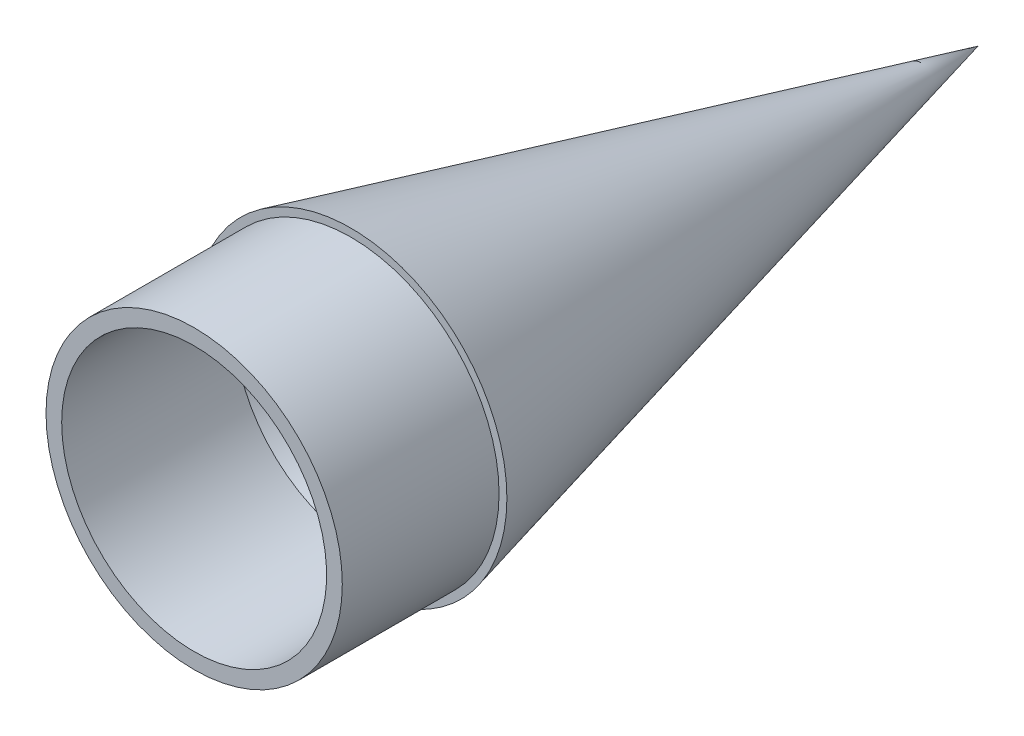
ISO-10303-21;
HEADER;
FILE_DESCRIPTION(('STEP AP214'),'2;1');
FILE_NAME('part.step','',(''),(''),'','','');
FILE_SCHEMA(('AUTOMOTIVE_DESIGN { 1 0 10303 214 1 1 1 1 }'));
ENDSEC;
DATA;
#1=APPLICATION_CONTEXT('core data for automotive mechanical design processes');
#2=APPLICATION_PROTOCOL_DEFINITION('international standard','automotive_design',2000,#1);
#3=PRODUCT_CONTEXT('',#1,'mechanical');
#4=PRODUCT('Part','Part','',(#3));
#5=PRODUCT_RELATED_PRODUCT_CATEGORY('part','',(#4));
#6=PRODUCT_DEFINITION_FORMATION('','',#4);
#7=PRODUCT_DEFINITION_CONTEXT('part definition',#1,'design');
#8=PRODUCT_DEFINITION('design','',#6,#7);
#9=PRODUCT_DEFINITION_SHAPE('','',#8);
#10=(LENGTH_UNIT() NAMED_UNIT(*) SI_UNIT(.MILLI.,.METRE.));
#11=(NAMED_UNIT(*) PLANE_ANGLE_UNIT() SI_UNIT($,.RADIAN.));
#12=(NAMED_UNIT(*) SI_UNIT($,.STERADIAN.) SOLID_ANGLE_UNIT());
#13=UNCERTAINTY_MEASURE_WITH_UNIT(LENGTH_MEASURE(1.E-05),#10,'distance_accuracy_value','');
#14=(GEOMETRIC_REPRESENTATION_CONTEXT(3) GLOBAL_UNCERTAINTY_ASSIGNED_CONTEXT((#13)) GLOBAL_UNIT_ASSIGNED_CONTEXT((#10,
#11,#12)) REPRESENTATION_CONTEXT('',''));
#15=CARTESIAN_POINT('',(0.,0.,0.));
#16=DIRECTION('',(0.,0.,1.));
#17=DIRECTION('',(1.,0.,0.));
#18=AXIS2_PLACEMENT_3D('',#15,#16,#17);
#19=CARTESIAN_POINT('',(-17.6436635561616,0.,20.));
#20=DIRECTION('',(0.,0.,-1.));
#21=DIRECTION('',(-1.,0.,0.));
#22=AXIS2_PLACEMENT_3D('',#19,#20,#21);
#23=PLANE('',#22);
#24=CARTESIAN_POINT('',(0.,0.,20.));
#25=DIRECTION('',(0.,0.,-1.));
#26=DIRECTION('',(-1.,0.,0.));
#27=AXIS2_PLACEMENT_3D('',#24,#25,#26);
#28=CIRCLE('',#27,16.9);
#29=CARTESIAN_POINT('',(-16.9,0.,20.));
#30=VERTEX_POINT('',#29);
#31=EDGE_CURVE('E74',#30,#30,#28,.F.);
#32=ORIENTED_EDGE('',*,*,#31,.F.);
#33=EDGE_LOOP('',(#32));
#34=FACE_BOUND('',#33,.T.);
#35=CARTESIAN_POINT('',(0.,0.,20.));
#36=DIRECTION('',(0.,0.,1.));
#37=DIRECTION('',(1.,0.,0.));
#38=AXIS2_PLACEMENT_3D('',#35,#36,#37);
#39=CIRCLE('',#38,18.9);
#40=CARTESIAN_POINT('',(18.9,0.,20.));
#41=VERTEX_POINT('',#40);
#42=EDGE_CURVE('E11',#41,#41,#39,.T.);
#43=ORIENTED_EDGE('',*,*,#42,.T.);
#44=EDGE_LOOP('',(#43));
#45=FACE_BOUND('',#44,.T.);
#46=ADVANCED_FACE('F37',(#34,#45),#23,.F.);
#47=CARTESIAN_POINT('',(0.,0.,20.));
#48=DIRECTION('',(0.,0.,1.));
#49=DIRECTION('',(1.,0.,0.));
#50=AXIS2_PLACEMENT_3D('',#47,#48,#49);
#51=CYLINDRICAL_SURFACE('',#50,18.9);
#52=ORIENTED_EDGE('',*,*,#42,.F.);
#53=EDGE_LOOP('',(#52));
#54=FACE_BOUND('',#53,.T.);
#55=CARTESIAN_POINT('',(0.,0.,0.));
#56=DIRECTION('',(0.,0.,1.));
#57=DIRECTION('',(1.,0.,0.));
#58=AXIS2_PLACEMENT_3D('',#55,#56,#57);
#59=CIRCLE('',#58,18.9);
#60=CARTESIAN_POINT('',(18.9,0.,0.));
#61=VERTEX_POINT('',#60);
#62=EDGE_CURVE('E44',#61,#61,#59,.T.);
#63=ORIENTED_EDGE('',*,*,#62,.T.);
#64=EDGE_LOOP('',(#63));
#65=FACE_BOUND('',#64,.T.);
#66=ADVANCED_FACE('F64',(#54,#65),#51,.T.);
#67=CARTESIAN_POINT('',(-19.9,0.,0.));
#68=DIRECTION('',(0.,0.,-1.));
#69=DIRECTION('',(-1.,0.,0.));
#70=AXIS2_PLACEMENT_3D('',#67,#68,#69);
#71=PLANE('',#70);
#72=ORIENTED_EDGE('',*,*,#62,.F.);
#73=EDGE_LOOP('',(#72));
#74=FACE_BOUND('',#73,.T.);
#75=CARTESIAN_POINT('',(0.,0.,0.));
#76=DIRECTION('',(0.,0.,1.));
#77=DIRECTION('',(1.,0.,0.));
#78=AXIS2_PLACEMENT_3D('',#75,#76,#77);
#79=CIRCLE('',#78,19.9);
#80=CARTESIAN_POINT('',(19.9,0.,0.));
#81=VERTEX_POINT('',#80);
#82=EDGE_CURVE('E80',#81,#81,#79,.T.);
#83=ORIENTED_EDGE('',*,*,#82,.T.);
#84=EDGE_LOOP('',(#83));
#85=FACE_BOUND('',#84,.T.);
#86=ADVANCED_FACE('F69',(#74,#85),#71,.F.);
#87=CARTESIAN_POINT('',(0.,0.,-80.));
#88=DIRECTION('',(0.,0.,1.));
#89=DIRECTION('',(1.,0.,0.));
#90=AXIS2_PLACEMENT_3D('',#87,#88,#89);
#91=CONICAL_SURFACE('',#90,0.,0.243801846959323);
#92=ORIENTED_EDGE('',*,*,#82,.F.);
#93=EDGE_LOOP('',(#92));
#94=FACE_BOUND('',#93,.T.);
#95=CARTESIAN_POINT('',(0.,0.,-80.));
#96=VERTEX_POINT('',#95);
#97=VERTEX_LOOP('',#96);
#98=FACE_BOUND('',#97,.T.);
#99=ADVANCED_FACE('F93',(#94,#98),#91,.T.);
#100=CARTESIAN_POINT('',(0.,0.,20.));
#101=DIRECTION('',(0.,0.,1.));
#102=DIRECTION('',(1.,0.,0.));
#103=AXIS2_PLACEMENT_3D('',#100,#101,#102);
#104=CYLINDRICAL_SURFACE('',#103,16.9);
#105=ORIENTED_EDGE('',*,*,#31,.T.);
#106=EDGE_LOOP('',(#105));
#107=FACE_BOUND('',#106,.T.);
#108=CARTESIAN_POINT('',(0.,0.,-2.));
#109=DIRECTION('',(0.,0.,-1.));
#110=DIRECTION('',(-1.,0.,0.));
#111=AXIS2_PLACEMENT_3D('',#108,#109,#110);
#112=CIRCLE('',#111,16.9);
#113=CARTESIAN_POINT('',(-16.9,0.,-2.));
#114=VERTEX_POINT('',#113);
#115=EDGE_CURVE('E85',#114,#114,#112,.F.);
#116=ORIENTED_EDGE('',*,*,#115,.F.);
#117=EDGE_LOOP('',(#116));
#118=FACE_BOUND('',#117,.T.);
#119=ADVANCED_FACE('F58',(#107,#118),#104,.F.);
#120=CARTESIAN_POINT('',(-19.9,0.,-2.));
#121=DIRECTION('',(0.,0.,-1.));
#122=DIRECTION('',(-1.,0.,0.));
#123=AXIS2_PLACEMENT_3D('',#120,#121,#122);
#124=PLANE('',#123);
#125=ORIENTED_EDGE('',*,*,#115,.T.);
#126=EDGE_LOOP('',(#125));
#127=FACE_BOUND('',#126,.T.);
#128=CARTESIAN_POINT('',(0.,0.,-2.));
#129=DIRECTION('',(0.,0.,-1.));
#130=DIRECTION('',(-1.,0.,0.));
#131=AXIS2_PLACEMENT_3D('',#128,#129,#130);
#132=CIRCLE('',#131,17.3415520991544);
#133=CARTESIAN_POINT('',(-17.3415520991544,0.,-2.));
#134=VERTEX_POINT('',#133);
#135=EDGE_CURVE('E86',#134,#134,#132,.F.);
#136=ORIENTED_EDGE('',*,*,#135,.F.);
#137=EDGE_LOOP('',(#136));
#138=FACE_BOUND('',#137,.T.);
#139=ADVANCED_FACE('F52',(#127,#138),#124,.T.);
#140=CARTESIAN_POINT('',(0.,0.,-71.7147823081583));
#141=DIRECTION('',(0.,0.,1.));
#142=DIRECTION('',(1.,0.,0.));
#143=AXIS2_PLACEMENT_3D('',#140,#141,#142);
#144=CONICAL_SURFACE('',#143,0.,0.243801846959323);
#145=ORIENTED_EDGE('',*,*,#135,.T.);
#146=EDGE_LOOP('',(#145));
#147=FACE_BOUND('',#146,.T.);
#148=CARTESIAN_POINT('',(0.,0.,-71.7147823081583));
#149=VERTEX_POINT('',#148);
#150=VERTEX_LOOP('',#149);
#151=FACE_BOUND('',#150,.T.);
#152=ADVANCED_FACE('F50',(#147,#151),#144,.F.);
#153=CLOSED_SHELL('',(#46,#66,#86,#99,#119,#139,#152));
#154=MANIFOLD_SOLID_BREP('B2',#153);
#155=ADVANCED_BREP_SHAPE_REPRESENTATION('',(#18,#154),#14);
#156=SHAPE_DEFINITION_REPRESENTATION(#9,#155);
ENDSEC;
END-ISO-10303-21;
